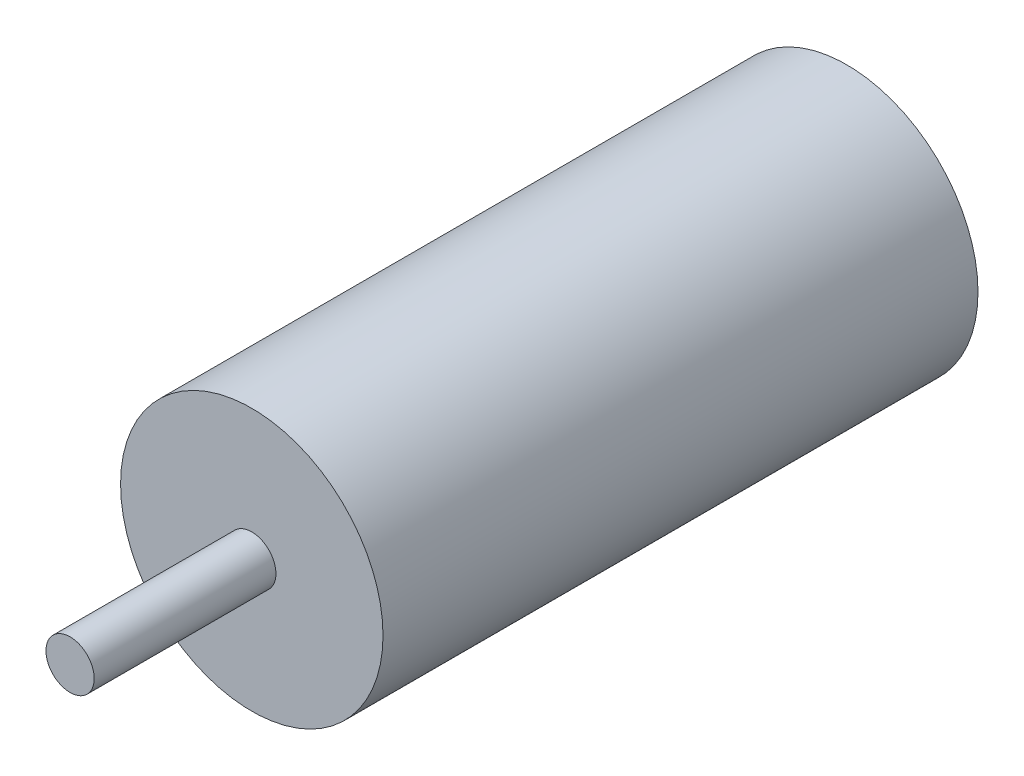
ISO-10303-21;
HEADER;
FILE_DESCRIPTION(('STEP AP214'),'2;1');
FILE_NAME('part.step','',(''),(''),'','','');
FILE_SCHEMA(('AUTOMOTIVE_DESIGN { 1 0 10303 214 1 1 1 1 }'));
ENDSEC;
DATA;
#1=APPLICATION_CONTEXT('core data for automotive mechanical design processes');
#2=APPLICATION_PROTOCOL_DEFINITION('international standard','automotive_design',2000,#1);
#3=PRODUCT_CONTEXT('',#1,'mechanical');
#4=PRODUCT('Part','Part','',(#3));
#5=PRODUCT_RELATED_PRODUCT_CATEGORY('part','',(#4));
#6=PRODUCT_DEFINITION_FORMATION('','',#4);
#7=PRODUCT_DEFINITION_CONTEXT('part definition',#1,'design');
#8=PRODUCT_DEFINITION('design','',#6,#7);
#9=PRODUCT_DEFINITION_SHAPE('','',#8);
#10=(LENGTH_UNIT() NAMED_UNIT(*) SI_UNIT(.MILLI.,.METRE.));
#11=(NAMED_UNIT(*) PLANE_ANGLE_UNIT() SI_UNIT($,.RADIAN.));
#12=(NAMED_UNIT(*) SI_UNIT($,.STERADIAN.) SOLID_ANGLE_UNIT());
#13=UNCERTAINTY_MEASURE_WITH_UNIT(LENGTH_MEASURE(1.E-05),#10,'distance_accuracy_value','');
#14=(GEOMETRIC_REPRESENTATION_CONTEXT(3) GLOBAL_UNCERTAINTY_ASSIGNED_CONTEXT((#13)) GLOBAL_UNIT_ASSIGNED_CONTEXT((#10,
#11,#12)) REPRESENTATION_CONTEXT('',''));
#15=CARTESIAN_POINT('',(0.,0.,0.));
#16=DIRECTION('',(0.,0.,1.));
#17=DIRECTION('',(1.,0.,0.));
#18=AXIS2_PLACEMENT_3D('',#15,#16,#17);
#19=CARTESIAN_POINT('',(0.,0.,50.099982096));
#20=DIRECTION('',(0.,0.,-1.));
#21=DIRECTION('',(-1.,0.,0.));
#22=AXIS2_PLACEMENT_3D('',#19,#20,#21);
#23=CYLINDRICAL_SURFACE('',#22,11.049);
#24=CARTESIAN_POINT('',(0.,0.,50.099982096));
#25=DIRECTION('',(0.,0.,1.));
#26=DIRECTION('',(1.,0.,0.));
#27=AXIS2_PLACEMENT_3D('',#24,#25,#26);
#28=CIRCLE('',#27,11.049);
#29=CARTESIAN_POINT('',(11.049,0.,50.099982096));
#30=VERTEX_POINT('',#29);
#31=EDGE_CURVE('E37',#30,#30,#28,.T.);
#32=ORIENTED_EDGE('',*,*,#31,.F.);
#33=EDGE_LOOP('',(#32));
#34=FACE_BOUND('',#33,.T.);
#35=CARTESIAN_POINT('',(0.,0.,0.));
#36=DIRECTION('',(0.,0.,1.));
#37=DIRECTION('',(1.,0.,0.));
#38=AXIS2_PLACEMENT_3D('',#35,#36,#37);
#39=CIRCLE('',#38,11.049);
#40=CARTESIAN_POINT('',(11.049,0.,0.));
#41=VERTEX_POINT('',#40);
#42=EDGE_CURVE('E33',#41,#41,#39,.T.);
#43=ORIENTED_EDGE('',*,*,#42,.T.);
#44=EDGE_LOOP('',(#43));
#45=FACE_BOUND('',#44,.T.);
#46=ADVANCED_FACE('F30',(#34,#45),#23,.T.);
#47=CARTESIAN_POINT('',(0.,0.,50.099982096));
#48=DIRECTION('',(0.,0.,1.));
#49=DIRECTION('',(1.,0.,0.));
#50=AXIS2_PLACEMENT_3D('',#47,#48,#49);
#51=PLANE('',#50);
#52=CARTESIAN_POINT('',(0.,0.,50.099982096));
#53=DIRECTION('',(0.,0.,1.));
#54=DIRECTION('',(1.,0.,0.));
#55=AXIS2_PLACEMENT_3D('',#52,#53,#54);
#56=CIRCLE('',#55,2.032);
#57=CARTESIAN_POINT('',(2.032,0.,50.099982096));
#58=VERTEX_POINT('',#57);
#59=EDGE_CURVE('E10',#58,#58,#56,.T.);
#60=ORIENTED_EDGE('',*,*,#59,.F.);
#61=EDGE_LOOP('',(#60));
#62=FACE_BOUND('',#61,.T.);
#63=ORIENTED_EDGE('',*,*,#31,.T.);
#64=EDGE_LOOP('',(#63));
#65=FACE_BOUND('',#64,.T.);
#66=ADVANCED_FACE('F54',(#62,#65),#51,.T.);
#67=CARTESIAN_POINT('',(0.,0.,0.));
#68=DIRECTION('',(0.,0.,1.));
#69=DIRECTION('',(1.,0.,0.));
#70=AXIS2_PLACEMENT_3D('',#67,#68,#69);
#71=PLANE('',#70);
#72=ORIENTED_EDGE('',*,*,#42,.F.);
#73=EDGE_LOOP('',(#72));
#74=FACE_BOUND('',#73,.T.);
#75=ADVANCED_FACE('F51',(#74),#71,.F.);
#76=CARTESIAN_POINT('',(0.,0.,65.400079004));
#77=DIRECTION('',(0.,0.,-1.));
#78=DIRECTION('',(-1.,0.,0.));
#79=AXIS2_PLACEMENT_3D('',#76,#77,#78);
#80=CYLINDRICAL_SURFACE('',#79,2.032);
#81=CARTESIAN_POINT('',(0.,0.,65.400079004));
#82=DIRECTION('',(0.,0.,1.));
#83=DIRECTION('',(1.,0.,0.));
#84=AXIS2_PLACEMENT_3D('',#81,#82,#83);
#85=CIRCLE('',#84,2.032);
#86=CARTESIAN_POINT('',(2.032,0.,65.400079004));
#87=VERTEX_POINT('',#86);
#88=EDGE_CURVE('E43',#87,#87,#85,.T.);
#89=ORIENTED_EDGE('',*,*,#88,.F.);
#90=EDGE_LOOP('',(#89));
#91=FACE_BOUND('',#90,.T.);
#92=ORIENTED_EDGE('',*,*,#59,.T.);
#93=EDGE_LOOP('',(#92));
#94=FACE_BOUND('',#93,.T.);
#95=ADVANCED_FACE('F53',(#91,#94),#80,.T.);
#96=CARTESIAN_POINT('',(0.,0.,65.400079004));
#97=DIRECTION('',(0.,0.,1.));
#98=DIRECTION('',(1.,0.,0.));
#99=AXIS2_PLACEMENT_3D('',#96,#97,#98);
#100=PLANE('',#99);
#101=ORIENTED_EDGE('',*,*,#88,.T.);
#102=EDGE_LOOP('',(#101));
#103=FACE_BOUND('',#102,.T.);
#104=ADVANCED_FACE('F59',(#103),#100,.T.);
#105=CLOSED_SHELL('',(#46,#66,#75,#95,#104));
#106=MANIFOLD_SOLID_BREP('B2',#105);
#107=ADVANCED_BREP_SHAPE_REPRESENTATION('',(#18,#106),#14);
#108=SHAPE_DEFINITION_REPRESENTATION(#9,#107);
ENDSEC;
END-ISO-10303-21;
